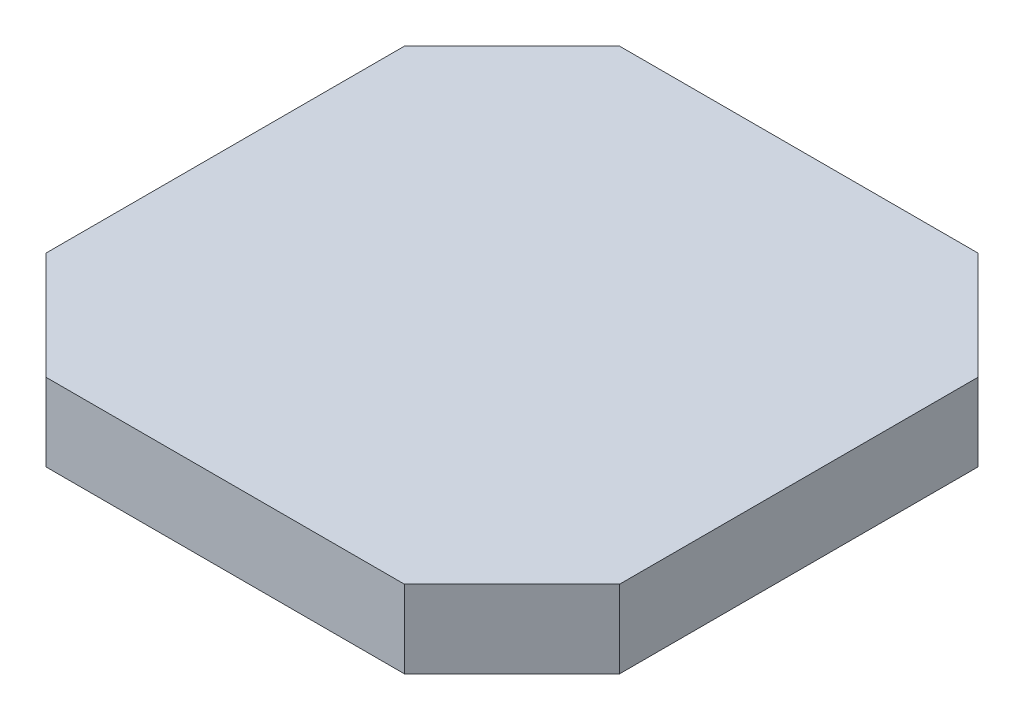
ISO-10303-21;
HEADER;
FILE_DESCRIPTION(('STEP AP214'),'2;1');
FILE_NAME('part.step','',(''),(''),'','','');
FILE_SCHEMA(('AUTOMOTIVE_DESIGN { 1 0 10303 214 1 1 1 1 }'));
ENDSEC;
DATA;
#1=APPLICATION_CONTEXT('core data for automotive mechanical design processes');
#2=APPLICATION_PROTOCOL_DEFINITION('international standard','automotive_design',2000,#1);
#3=PRODUCT_CONTEXT('',#1,'mechanical');
#4=PRODUCT('Part','Part','',(#3));
#5=PRODUCT_RELATED_PRODUCT_CATEGORY('part','',(#4));
#6=PRODUCT_DEFINITION_FORMATION('','',#4);
#7=PRODUCT_DEFINITION_CONTEXT('part definition',#1,'design');
#8=PRODUCT_DEFINITION('design','',#6,#7);
#9=PRODUCT_DEFINITION_SHAPE('','',#8);
#10=(LENGTH_UNIT() NAMED_UNIT(*) SI_UNIT(.MILLI.,.METRE.));
#11=(NAMED_UNIT(*) PLANE_ANGLE_UNIT() SI_UNIT($,.RADIAN.));
#12=(NAMED_UNIT(*) SI_UNIT($,.STERADIAN.) SOLID_ANGLE_UNIT());
#13=UNCERTAINTY_MEASURE_WITH_UNIT(LENGTH_MEASURE(1.E-05),#10,'distance_accuracy_value','');
#14=(GEOMETRIC_REPRESENTATION_CONTEXT(3) GLOBAL_UNCERTAINTY_ASSIGNED_CONTEXT((#13)) GLOBAL_UNIT_ASSIGNED_CONTEXT((#10,
#11,#12)) REPRESENTATION_CONTEXT('',''));
#15=CARTESIAN_POINT('',(0.,0.,0.));
#16=DIRECTION('',(0.,0.,1.));
#17=DIRECTION('',(1.,0.,0.));
#18=AXIS2_PLACEMENT_3D('',#15,#16,#17);
#19=CARTESIAN_POINT('',(-1.5,0.65,2.4));
#20=DIRECTION('',(0.707106781186542,0.,-0.707106781186553));
#21=DIRECTION('',(0.,-1.,0.));
#22=AXIS2_PLACEMENT_3D('',#19,#20,#21);
#23=PLANE('',#22);
#24=DIRECTION('',(0.707106781186553,0.,0.707106781186542));
#25=VECTOR('',#24,1.);
#26=CARTESIAN_POINT('',(-1.5,0.,2.4));
#27=LINE('',#26,#25);
#28=CARTESIAN_POINT('',(-2.4,0.,1.5));
#29=VERTEX_POINT('',#28);
#30=CARTESIAN_POINT('',(-1.5,0.,2.4));
#31=VERTEX_POINT('',#30);
#32=EDGE_CURVE('E11',#29,#31,#27,.T.);
#33=ORIENTED_EDGE('',*,*,#32,.T.);
#34=DIRECTION('',(0.,-1.,0.));
#35=VECTOR('',#34,1.);
#36=CARTESIAN_POINT('',(-1.5,0.65,2.4));
#37=LINE('',#36,#35);
#38=CARTESIAN_POINT('',(-1.5,0.65,2.4));
#39=VERTEX_POINT('',#38);
#40=EDGE_CURVE('E24',#39,#31,#37,.T.);
#41=ORIENTED_EDGE('',*,*,#40,.F.);
#42=DIRECTION('',(0.707106781186553,0.,0.707106781186542));
#43=VECTOR('',#42,1.);
#44=CARTESIAN_POINT('',(-1.5,0.65,2.4));
#45=LINE('',#44,#43);
#46=CARTESIAN_POINT('',(-2.4,0.65,1.5));
#47=VERTEX_POINT('',#46);
#48=EDGE_CURVE('E144',#47,#39,#45,.T.);
#49=ORIENTED_EDGE('',*,*,#48,.F.);
#50=DIRECTION('',(0.,-1.,0.));
#51=VECTOR('',#50,1.);
#52=CARTESIAN_POINT('',(-2.4,0.65,1.5));
#53=LINE('',#52,#51);
#54=EDGE_CURVE('E102',#47,#29,#53,.T.);
#55=ORIENTED_EDGE('',*,*,#54,.T.);
#56=EDGE_LOOP('',(#33,#41,#49,#55));
#57=FACE_BOUND('',#56,.T.);
#58=ADVANCED_FACE('F17',(#57),#23,.F.);
#59=CARTESIAN_POINT('',(-1.5,0.65,2.4));
#60=DIRECTION('',(0.,0.,-1.));
#61=DIRECTION('',(0.,-1.,0.));
#62=AXIS2_PLACEMENT_3D('',#59,#60,#61);
#63=PLANE('',#62);
#64=DIRECTION('',(1.,0.,0.));
#65=VECTOR('',#64,1.);
#66=CARTESIAN_POINT('',(-1.5,0.,2.4));
#67=LINE('',#66,#65);
#68=CARTESIAN_POINT('',(1.5,0.,2.4));
#69=VERTEX_POINT('',#68);
#70=EDGE_CURVE('E141',#31,#69,#67,.T.);
#71=ORIENTED_EDGE('',*,*,#70,.T.);
#72=DIRECTION('',(0.,-1.,0.));
#73=VECTOR('',#72,1.);
#74=CARTESIAN_POINT('',(1.5,0.65,2.4));
#75=LINE('',#74,#73);
#76=CARTESIAN_POINT('',(1.5,0.65,2.4));
#77=VERTEX_POINT('',#76);
#78=EDGE_CURVE('E138',#77,#69,#75,.T.);
#79=ORIENTED_EDGE('',*,*,#78,.F.);
#80=DIRECTION('',(1.,0.,0.));
#81=VECTOR('',#80,1.);
#82=CARTESIAN_POINT('',(-1.5,0.65,2.4));
#83=LINE('',#82,#81);
#84=EDGE_CURVE('E135',#39,#77,#83,.T.);
#85=ORIENTED_EDGE('',*,*,#84,.F.);
#86=ORIENTED_EDGE('',*,*,#40,.T.);
#87=EDGE_LOOP('',(#71,#79,#85,#86));
#88=FACE_BOUND('',#87,.T.);
#89=ADVANCED_FACE('F147',(#88),#63,.F.);
#90=CARTESIAN_POINT('',(2.4,0.65,1.5));
#91=DIRECTION('',(-0.707106781186542,0.,-0.707106781186553));
#92=DIRECTION('',(-0.707106781186553,0.,0.707106781186542));
#93=AXIS2_PLACEMENT_3D('',#90,#91,#92);
#94=PLANE('',#93);
#95=DIRECTION('',(0.707106781186553,0.,-0.707106781186542));
#96=VECTOR('',#95,1.);
#97=CARTESIAN_POINT('',(2.4,0.,1.5));
#98=LINE('',#97,#96);
#99=CARTESIAN_POINT('',(2.4,0.,1.5));
#100=VERTEX_POINT('',#99);
#101=EDGE_CURVE('E133',#69,#100,#98,.T.);
#102=ORIENTED_EDGE('',*,*,#101,.T.);
#103=DIRECTION('',(0.,-1.,0.));
#104=VECTOR('',#103,1.);
#105=CARTESIAN_POINT('',(2.4,0.65,1.5));
#106=LINE('',#105,#104);
#107=CARTESIAN_POINT('',(2.4,0.65,1.5));
#108=VERTEX_POINT('',#107);
#109=EDGE_CURVE('E130',#108,#100,#106,.T.);
#110=ORIENTED_EDGE('',*,*,#109,.F.);
#111=DIRECTION('',(0.707106781186553,0.,-0.707106781186542));
#112=VECTOR('',#111,1.);
#113=CARTESIAN_POINT('',(2.4,0.65,1.5));
#114=LINE('',#113,#112);
#115=EDGE_CURVE('E127',#77,#108,#114,.T.);
#116=ORIENTED_EDGE('',*,*,#115,.F.);
#117=ORIENTED_EDGE('',*,*,#78,.T.);
#118=EDGE_LOOP('',(#102,#110,#116,#117));
#119=FACE_BOUND('',#118,.T.);
#120=ADVANCED_FACE('F153',(#119),#94,.F.);
#121=CARTESIAN_POINT('',(2.4,0.65,-1.5));
#122=DIRECTION('',(-1.,0.,0.));
#123=DIRECTION('',(0.,0.,1.));
#124=AXIS2_PLACEMENT_3D('',#121,#122,#123);
#125=PLANE('',#124);
#126=DIRECTION('',(0.,0.,-1.));
#127=VECTOR('',#126,1.);
#128=CARTESIAN_POINT('',(2.4,0.,-1.5));
#129=LINE('',#128,#127);
#130=CARTESIAN_POINT('',(2.4,0.,-1.5));
#131=VERTEX_POINT('',#130);
#132=EDGE_CURVE('E125',#100,#131,#129,.T.);
#133=ORIENTED_EDGE('',*,*,#132,.T.);
#134=DIRECTION('',(0.,-1.,0.));
#135=VECTOR('',#134,1.);
#136=CARTESIAN_POINT('',(2.4,0.65,-1.5));
#137=LINE('',#136,#135);
#138=CARTESIAN_POINT('',(2.4,0.65,-1.5));
#139=VERTEX_POINT('',#138);
#140=EDGE_CURVE('E122',#139,#131,#137,.T.);
#141=ORIENTED_EDGE('',*,*,#140,.F.);
#142=DIRECTION('',(0.,0.,-1.));
#143=VECTOR('',#142,1.);
#144=CARTESIAN_POINT('',(2.4,0.65,-1.5));
#145=LINE('',#144,#143);
#146=EDGE_CURVE('E119',#108,#139,#145,.T.);
#147=ORIENTED_EDGE('',*,*,#146,.F.);
#148=ORIENTED_EDGE('',*,*,#109,.T.);
#149=EDGE_LOOP('',(#133,#141,#147,#148));
#150=FACE_BOUND('',#149,.T.);
#151=ADVANCED_FACE('F157',(#150),#125,.F.);
#152=CARTESIAN_POINT('',(1.5,0.65,-2.4));
#153=DIRECTION('',(-0.70710678118655,0.,0.707106781186545));
#154=DIRECTION('',(0.,1.,0.));
#155=AXIS2_PLACEMENT_3D('',#152,#153,#154);
#156=PLANE('',#155);
#157=DIRECTION('',(-0.707106781186545,0.,-0.70710678118655));
#158=VECTOR('',#157,1.);
#159=CARTESIAN_POINT('',(1.5,0.,-2.4));
#160=LINE('',#159,#158);
#161=CARTESIAN_POINT('',(1.5,0.,-2.4));
#162=VERTEX_POINT('',#161);
#163=EDGE_CURVE('E117',#131,#162,#160,.T.);
#164=ORIENTED_EDGE('',*,*,#163,.T.);
#165=DIRECTION('',(0.,-1.,0.));
#166=VECTOR('',#165,1.);
#167=CARTESIAN_POINT('',(1.5,0.65,-2.4));
#168=LINE('',#167,#166);
#169=CARTESIAN_POINT('',(1.5,0.65,-2.4));
#170=VERTEX_POINT('',#169);
#171=EDGE_CURVE('E114',#170,#162,#168,.T.);
#172=ORIENTED_EDGE('',*,*,#171,.F.);
#173=DIRECTION('',(-0.707106781186545,0.,-0.70710678118655));
#174=VECTOR('',#173,1.);
#175=CARTESIAN_POINT('',(1.5,0.65,-2.4));
#176=LINE('',#175,#174);
#177=EDGE_CURVE('E112',#139,#170,#176,.T.);
#178=ORIENTED_EDGE('',*,*,#177,.F.);
#179=ORIENTED_EDGE('',*,*,#140,.T.);
#180=EDGE_LOOP('',(#164,#172,#178,#179));
#181=FACE_BOUND('',#180,.T.);
#182=ADVANCED_FACE('F160',(#181),#156,.F.);
#183=CARTESIAN_POINT('',(-1.5,0.65,-2.4));
#184=DIRECTION('',(0.,0.,1.));
#185=DIRECTION('',(1.,0.,0.));
#186=AXIS2_PLACEMENT_3D('',#183,#184,#185);
#187=PLANE('',#186);
#188=DIRECTION('',(-1.,0.,0.));
#189=VECTOR('',#188,1.);
#190=CARTESIAN_POINT('',(-1.5,0.,-2.4));
#191=LINE('',#190,#189);
#192=CARTESIAN_POINT('',(-1.5,0.,-2.4));
#193=VERTEX_POINT('',#192);
#194=EDGE_CURVE('E110',#162,#193,#191,.T.);
#195=ORIENTED_EDGE('',*,*,#194,.T.);
#196=DIRECTION('',(0.,-1.,0.));
#197=VECTOR('',#196,1.);
#198=CARTESIAN_POINT('',(-1.5,0.65,-2.4));
#199=LINE('',#198,#197);
#200=CARTESIAN_POINT('',(-1.5,0.65,-2.4));
#201=VERTEX_POINT('',#200);
#202=EDGE_CURVE('E108',#201,#193,#199,.T.);
#203=ORIENTED_EDGE('',*,*,#202,.F.);
#204=DIRECTION('',(-1.,0.,0.));
#205=VECTOR('',#204,1.);
#206=CARTESIAN_POINT('',(-1.5,0.65,-2.4));
#207=LINE('',#206,#205);
#208=EDGE_CURVE('E97',#170,#201,#207,.T.);
#209=ORIENTED_EDGE('',*,*,#208,.F.);
#210=ORIENTED_EDGE('',*,*,#171,.T.);
#211=EDGE_LOOP('',(#195,#203,#209,#210));
#212=FACE_BOUND('',#211,.T.);
#213=ADVANCED_FACE('F163',(#212),#187,.F.);
#214=CARTESIAN_POINT('',(-2.4,0.65,-1.5));
#215=DIRECTION('',(0.707106781186549,0.,0.707106781186546));
#216=DIRECTION('',(0.,-1.,0.));
#217=AXIS2_PLACEMENT_3D('',#214,#215,#216);
#218=PLANE('',#217);
#219=DIRECTION('',(-0.707106781186546,0.,0.707106781186549));
#220=VECTOR('',#219,1.);
#221=CARTESIAN_POINT('',(-2.4,0.,-1.5));
#222=LINE('',#221,#220);
#223=CARTESIAN_POINT('',(-2.4,0.,-1.5));
#224=VERTEX_POINT('',#223);
#225=EDGE_CURVE('E84',#193,#224,#222,.T.);
#226=ORIENTED_EDGE('',*,*,#225,.T.);
#227=DIRECTION('',(0.,-1.,0.));
#228=VECTOR('',#227,1.);
#229=CARTESIAN_POINT('',(-2.4,0.65,-1.5));
#230=LINE('',#229,#228);
#231=CARTESIAN_POINT('',(-2.4,0.65,-1.5));
#232=VERTEX_POINT('',#231);
#233=EDGE_CURVE('E78',#232,#224,#230,.T.);
#234=ORIENTED_EDGE('',*,*,#233,.F.);
#235=DIRECTION('',(-0.707106781186546,0.,0.707106781186549));
#236=VECTOR('',#235,1.);
#237=CARTESIAN_POINT('',(-2.4,0.65,-1.5));
#238=LINE('',#237,#236);
#239=EDGE_CURVE('E82',#201,#232,#238,.T.);
#240=ORIENTED_EDGE('',*,*,#239,.F.);
#241=ORIENTED_EDGE('',*,*,#202,.T.);
#242=EDGE_LOOP('',(#226,#234,#240,#241));
#243=FACE_BOUND('',#242,.T.);
#244=ADVANCED_FACE('F80',(#243),#218,.F.);
#245=CARTESIAN_POINT('',(-2.4,0.65,1.5));
#246=DIRECTION('',(1.,0.,0.));
#247=DIRECTION('',(0.,1.,0.));
#248=AXIS2_PLACEMENT_3D('',#245,#246,#247);
#249=PLANE('',#248);
#250=DIRECTION('',(0.,0.,1.));
#251=VECTOR('',#250,1.);
#252=CARTESIAN_POINT('',(-2.4,0.,1.5));
#253=LINE('',#252,#251);
#254=EDGE_CURVE('E98',#224,#29,#253,.T.);
#255=ORIENTED_EDGE('',*,*,#254,.T.);
#256=ORIENTED_EDGE('',*,*,#54,.F.);
#257=DIRECTION('',(0.,0.,1.));
#258=VECTOR('',#257,1.);
#259=CARTESIAN_POINT('',(-2.4,0.65,1.5));
#260=LINE('',#259,#258);
#261=EDGE_CURVE('E94',#232,#47,#260,.T.);
#262=ORIENTED_EDGE('',*,*,#261,.F.);
#263=ORIENTED_EDGE('',*,*,#233,.T.);
#264=EDGE_LOOP('',(#255,#256,#262,#263));
#265=FACE_BOUND('',#264,.T.);
#266=ADVANCED_FACE('F101',(#265),#249,.F.);
#267=CARTESIAN_POINT('',(0.,0.65,0.));
#268=DIRECTION('',(0.,-1.,0.));
#269=DIRECTION('',(0.,0.,-1.));
#270=AXIS2_PLACEMENT_3D('',#267,#268,#269);
#271=PLANE('',#270);
#272=ORIENTED_EDGE('',*,*,#48,.T.);
#273=ORIENTED_EDGE('',*,*,#84,.T.);
#274=ORIENTED_EDGE('',*,*,#115,.T.);
#275=ORIENTED_EDGE('',*,*,#146,.T.);
#276=ORIENTED_EDGE('',*,*,#177,.T.);
#277=ORIENTED_EDGE('',*,*,#208,.T.);
#278=ORIENTED_EDGE('',*,*,#239,.T.);
#279=ORIENTED_EDGE('',*,*,#261,.T.);
#280=EDGE_LOOP('',(#272,#273,#274,#275,#276,#277,#278,#279));
#281=FACE_BOUND('',#280,.T.);
#282=ADVANCED_FACE('F93',(#281),#271,.F.);
#283=CARTESIAN_POINT('',(0.,0.,0.));
#284=DIRECTION('',(0.,-1.,0.));
#285=DIRECTION('',(0.,0.,-1.));
#286=AXIS2_PLACEMENT_3D('',#283,#284,#285);
#287=PLANE('',#286);
#288=ORIENTED_EDGE('',*,*,#32,.F.);
#289=ORIENTED_EDGE('',*,*,#254,.F.);
#290=ORIENTED_EDGE('',*,*,#225,.F.);
#291=ORIENTED_EDGE('',*,*,#194,.F.);
#292=ORIENTED_EDGE('',*,*,#163,.F.);
#293=ORIENTED_EDGE('',*,*,#132,.F.);
#294=ORIENTED_EDGE('',*,*,#101,.F.);
#295=ORIENTED_EDGE('',*,*,#70,.F.);
#296=EDGE_LOOP('',(#288,#289,#290,#291,#292,#293,#294,#295));
#297=FACE_BOUND('',#296,.T.);
#298=ADVANCED_FACE('F149',(#297),#287,.T.);
#299=CLOSED_SHELL('',(#58,#89,#120,#151,#182,#213,#244,#266,#282,#298));
#300=MANIFOLD_SOLID_BREP('B1',#299);
#301=ADVANCED_BREP_SHAPE_REPRESENTATION('',(#18,#300),#14);
#302=SHAPE_DEFINITION_REPRESENTATION(#9,#301);
ENDSEC;
END-ISO-10303-21;
